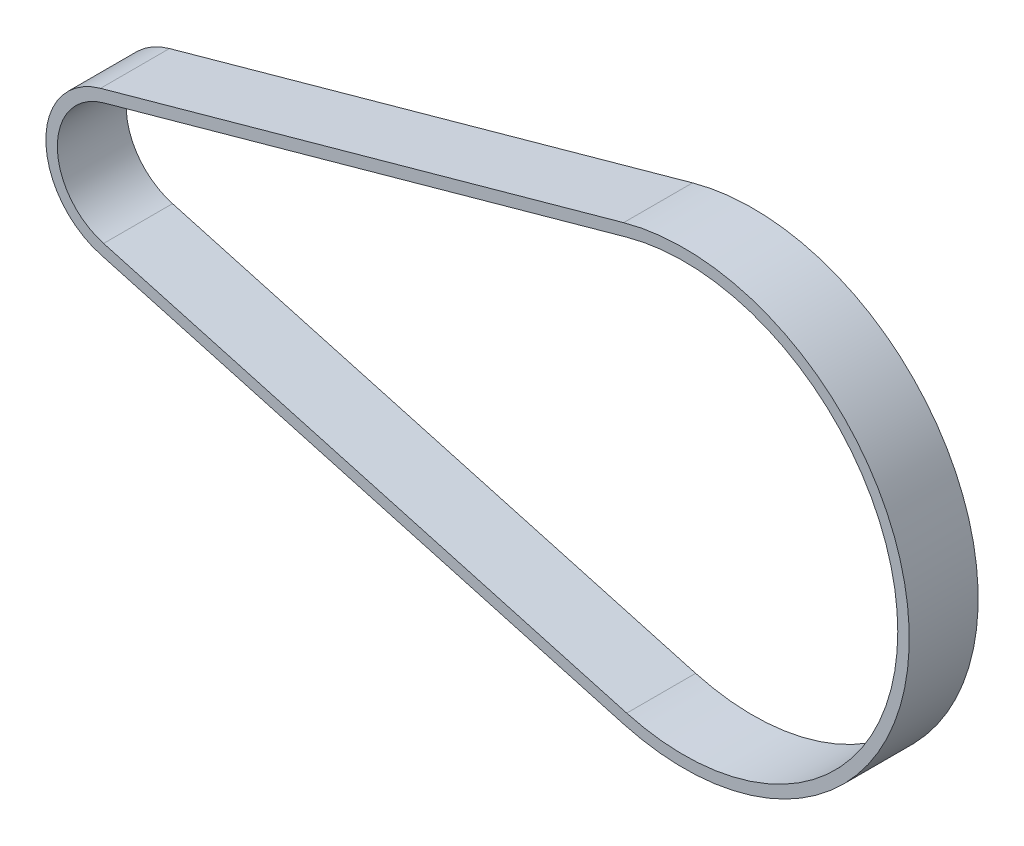
ISO-10303-21;
HEADER;
FILE_DESCRIPTION(('STEP AP214'),'2;1');
FILE_NAME('part.step','',(''),(''),'','','');
FILE_SCHEMA(('AUTOMOTIVE_DESIGN { 1 0 10303 214 1 1 1 1 }'));
ENDSEC;
DATA;
#1=APPLICATION_CONTEXT('core data for automotive mechanical design processes');
#2=APPLICATION_PROTOCOL_DEFINITION('international standard','automotive_design',2000,#1);
#3=PRODUCT_CONTEXT('',#1,'mechanical');
#4=PRODUCT('Part','Part','',(#3));
#5=PRODUCT_RELATED_PRODUCT_CATEGORY('part','',(#4));
#6=PRODUCT_DEFINITION_FORMATION('','',#4);
#7=PRODUCT_DEFINITION_CONTEXT('part definition',#1,'design');
#8=PRODUCT_DEFINITION('design','',#6,#7);
#9=PRODUCT_DEFINITION_SHAPE('','',#8);
#10=(LENGTH_UNIT() NAMED_UNIT(*) SI_UNIT(.MILLI.,.METRE.));
#11=(NAMED_UNIT(*) PLANE_ANGLE_UNIT() SI_UNIT($,.RADIAN.));
#12=(NAMED_UNIT(*) SI_UNIT($,.STERADIAN.) SOLID_ANGLE_UNIT());
#13=UNCERTAINTY_MEASURE_WITH_UNIT(LENGTH_MEASURE(1.E-05),#10,'distance_accuracy_value','');
#14=(GEOMETRIC_REPRESENTATION_CONTEXT(3) GLOBAL_UNCERTAINTY_ASSIGNED_CONTEXT((#13)) GLOBAL_UNIT_ASSIGNED_CONTEXT((#10,
#11,#12)) REPRESENTATION_CONTEXT('',''));
#15=CARTESIAN_POINT('',(0.,0.,0.));
#16=DIRECTION('',(0.,0.,1.));
#17=DIRECTION('',(1.,0.,0.));
#18=AXIS2_PLACEMENT_3D('',#15,#16,#17);
#19=CARTESIAN_POINT('',(0.,0.,6.));
#20=DIRECTION('',(0.,0.,1.));
#21=DIRECTION('',(1.,0.,0.));
#22=AXIS2_PLACEMENT_3D('',#19,#20,#21);
#23=PLANE('',#22);
#24=CARTESIAN_POINT('',(0.,0.,6.));
#25=DIRECTION('',(0.,0.,1.));
#26=DIRECTION('',(1.,0.,0.));
#27=AXIS2_PLACEMENT_3D('',#24,#25,#26);
#28=CIRCLE('',#27,6.5);
#29=CARTESIAN_POINT('',(-1.73863404689093,6.26315828085094,6.));
#30=VERTEX_POINT('',#29);
#31=CARTESIAN_POINT('',(-1.73863404689093,-6.26315828085094,6.));
#32=VERTEX_POINT('',#31);
#33=EDGE_CURVE('E135',#30,#32,#28,.T.);
#34=ORIENTED_EDGE('',*,*,#33,.T.);
#35=DIRECTION('',(0.963562812438606,-0.267482161060143,0.));
#36=VECTOR('',#35,1.);
#37=CARTESIAN_POINT('',(-1.73863404689093,-6.26315828085094,6.));
#38=LINE('',#37,#36);
#39=CARTESIAN_POINT('',(43.802,-18.9051023800454,6.));
#40=VERTEX_POINT('',#39);
#41=EDGE_CURVE('E138',#32,#40,#38,.T.);
#42=ORIENTED_EDGE('',*,*,#41,.T.);
#43=CARTESIAN_POINT('',(49.05,0.,6.));
#44=DIRECTION('',(0.,0.,1.));
#45=DIRECTION('',(1.,0.,0.));
#46=AXIS2_PLACEMENT_3D('',#43,#44,#45);
#47=CIRCLE('',#46,19.62);
#48=CARTESIAN_POINT('',(43.802,18.9051023800455,6.));
#49=VERTEX_POINT('',#48);
#50=EDGE_CURVE('E141',#40,#49,#47,.T.);
#51=ORIENTED_EDGE('',*,*,#50,.T.);
#52=DIRECTION('',(-0.963562812438606,-0.267482161060143,0.));
#53=VECTOR('',#52,1.);
#54=CARTESIAN_POINT('',(-1.73863404689093,6.26315828085094,6.));
#55=LINE('',#54,#53);
#56=EDGE_CURVE('E143',#49,#30,#55,.T.);
#57=ORIENTED_EDGE('',*,*,#56,.T.);
#58=EDGE_LOOP('',(#34,#42,#51,#57));
#59=FACE_BOUND('',#58,.T.);
#60=DIRECTION('',(0.963562812438606,-0.267482161060143,0.));
#61=VECTOR('',#60,1.);
#62=CARTESIAN_POINT('',(-1.47115188583079,-5.29959546841233,6.));
#63=LINE('',#62,#61);
#64=CARTESIAN_POINT('',(-1.47115188583079,-5.29959546841233,6.));
#65=VERTEX_POINT('',#64);
#66=CARTESIAN_POINT('',(44.0694821610601,-17.9415395676068,6.));
#67=VERTEX_POINT('',#66);
#68=EDGE_CURVE('E107',#65,#67,#63,.T.);
#69=ORIENTED_EDGE('',*,*,#68,.F.);
#70=CARTESIAN_POINT('',(0.,0.,6.));
#71=DIRECTION('',(0.,0.,1.));
#72=DIRECTION('',(1.,0.,0.));
#73=AXIS2_PLACEMENT_3D('',#70,#71,#72);
#74=CIRCLE('',#73,5.5);
#75=CARTESIAN_POINT('',(-1.47115188583079,5.29959546841233,6.));
#76=VERTEX_POINT('',#75);
#77=EDGE_CURVE('E99',#76,#65,#74,.T.);
#78=ORIENTED_EDGE('',*,*,#77,.F.);
#79=DIRECTION('',(-0.963562812438606,-0.267482161060143,0.));
#80=VECTOR('',#79,1.);
#81=CARTESIAN_POINT('',(-1.47115188583079,5.29959546841233,6.));
#82=LINE('',#81,#80);
#83=CARTESIAN_POINT('',(44.0694821610601,17.9415395676068,6.));
#84=VERTEX_POINT('',#83);
#85=EDGE_CURVE('E121',#84,#76,#82,.T.);
#86=ORIENTED_EDGE('',*,*,#85,.F.);
#87=CARTESIAN_POINT('',(49.05,0.,6.));
#88=DIRECTION('',(0.,0.,1.));
#89=DIRECTION('',(1.,0.,0.));
#90=AXIS2_PLACEMENT_3D('',#87,#88,#89);
#91=CIRCLE('',#90,18.62);
#92=EDGE_CURVE('E119',#67,#84,#91,.T.);
#93=ORIENTED_EDGE('',*,*,#92,.F.);
#94=EDGE_LOOP('',(#69,#78,#86,#93));
#95=FACE_BOUND('',#94,.T.);
#96=ADVANCED_FACE('F34',(#59,#95),#23,.T.);
#97=CARTESIAN_POINT('',(0.,0.,0.));
#98=DIRECTION('',(0.,0.,1.));
#99=DIRECTION('',(1.,0.,0.));
#100=AXIS2_PLACEMENT_3D('',#97,#98,#99);
#101=PLANE('',#100);
#102=CARTESIAN_POINT('',(0.,0.,0.));
#103=DIRECTION('',(0.,0.,1.));
#104=DIRECTION('',(1.,0.,0.));
#105=AXIS2_PLACEMENT_3D('',#102,#103,#104);
#106=CIRCLE('',#105,6.5);
#107=CARTESIAN_POINT('',(-1.73863404689093,6.26315828085094,0.));
#108=VERTEX_POINT('',#107);
#109=CARTESIAN_POINT('',(-1.73863404689093,-6.26315828085094,0.));
#110=VERTEX_POINT('',#109);
#111=EDGE_CURVE('E115',#108,#110,#106,.T.);
#112=ORIENTED_EDGE('',*,*,#111,.F.);
#113=DIRECTION('',(-0.963562812438606,-0.267482161060143,0.));
#114=VECTOR('',#113,1.);
#115=CARTESIAN_POINT('',(-1.73863404689093,6.26315828085094,0.));
#116=LINE('',#115,#114);
#117=CARTESIAN_POINT('',(43.802,18.9051023800455,0.));
#118=VERTEX_POINT('',#117);
#119=EDGE_CURVE('E139',#118,#108,#116,.T.);
#120=ORIENTED_EDGE('',*,*,#119,.F.);
#121=CARTESIAN_POINT('',(49.05,0.,0.));
#122=DIRECTION('',(0.,0.,1.));
#123=DIRECTION('',(1.,0.,0.));
#124=AXIS2_PLACEMENT_3D('',#121,#122,#123);
#125=CIRCLE('',#124,19.62);
#126=CARTESIAN_POINT('',(43.802,-18.9051023800454,0.));
#127=VERTEX_POINT('',#126);
#128=EDGE_CURVE('E150',#127,#118,#125,.T.);
#129=ORIENTED_EDGE('',*,*,#128,.F.);
#130=DIRECTION('',(0.963562812438606,-0.267482161060143,0.));
#131=VECTOR('',#130,1.);
#132=CARTESIAN_POINT('',(-1.73863404689093,-6.26315828085094,0.));
#133=LINE('',#132,#131);
#134=EDGE_CURVE('E148',#110,#127,#133,.T.);
#135=ORIENTED_EDGE('',*,*,#134,.F.);
#136=EDGE_LOOP('',(#112,#120,#129,#135));
#137=FACE_BOUND('',#136,.T.);
#138=CARTESIAN_POINT('',(0.,0.,0.));
#139=DIRECTION('',(0.,0.,1.));
#140=DIRECTION('',(1.,0.,0.));
#141=AXIS2_PLACEMENT_3D('',#138,#139,#140);
#142=CIRCLE('',#141,5.5);
#143=CARTESIAN_POINT('',(-1.47115188583079,5.29959546841233,0.));
#144=VERTEX_POINT('',#143);
#145=CARTESIAN_POINT('',(-1.47115188583079,-5.29959546841233,0.));
#146=VERTEX_POINT('',#145);
#147=EDGE_CURVE('E57',#144,#146,#142,.T.);
#148=ORIENTED_EDGE('',*,*,#147,.T.);
#149=DIRECTION('',(0.963562812438606,-0.267482161060143,0.));
#150=VECTOR('',#149,1.);
#151=CARTESIAN_POINT('',(-1.47115188583079,-5.29959546841233,0.));
#152=LINE('',#151,#150);
#153=CARTESIAN_POINT('',(44.0694821610601,-17.9415395676068,0.));
#154=VERTEX_POINT('',#153);
#155=EDGE_CURVE('E114',#146,#154,#152,.T.);
#156=ORIENTED_EDGE('',*,*,#155,.T.);
#157=CARTESIAN_POINT('',(49.05,0.,0.));
#158=DIRECTION('',(0.,0.,1.));
#159=DIRECTION('',(1.,0.,0.));
#160=AXIS2_PLACEMENT_3D('',#157,#158,#159);
#161=CIRCLE('',#160,18.62);
#162=CARTESIAN_POINT('',(44.0694821610601,17.9415395676068,0.));
#163=VERTEX_POINT('',#162);
#164=EDGE_CURVE('E127',#154,#163,#161,.T.);
#165=ORIENTED_EDGE('',*,*,#164,.T.);
#166=DIRECTION('',(-0.963562812438606,-0.267482161060143,0.));
#167=VECTOR('',#166,1.);
#168=CARTESIAN_POINT('',(-1.47115188583079,5.29959546841233,0.));
#169=LINE('',#168,#167);
#170=EDGE_CURVE('E108',#163,#144,#169,.T.);
#171=ORIENTED_EDGE('',*,*,#170,.T.);
#172=EDGE_LOOP('',(#148,#156,#165,#171));
#173=FACE_BOUND('',#172,.T.);
#174=ADVANCED_FACE('F168',(#137,#173),#101,.F.);
#175=CARTESIAN_POINT('',(0.,0.,6.));
#176=DIRECTION('',(0.,0.,-1.));
#177=DIRECTION('',(-1.,0.,0.));
#178=AXIS2_PLACEMENT_3D('',#175,#176,#177);
#179=CYLINDRICAL_SURFACE('',#178,6.5);
#180=ORIENTED_EDGE('',*,*,#111,.T.);
#181=DIRECTION('',(0.,0.,-1.));
#182=VECTOR('',#181,1.);
#183=CARTESIAN_POINT('',(-1.73863404689093,-6.26315828085094,6.));
#184=LINE('',#183,#182);
#185=EDGE_CURVE('E11',#32,#110,#184,.T.);
#186=ORIENTED_EDGE('',*,*,#185,.F.);
#187=ORIENTED_EDGE('',*,*,#33,.F.);
#188=DIRECTION('',(0.,0.,-1.));
#189=VECTOR('',#188,1.);
#190=CARTESIAN_POINT('',(-1.73863404689093,6.26315828085094,6.));
#191=LINE('',#190,#189);
#192=EDGE_CURVE('E145',#30,#108,#191,.T.);
#193=ORIENTED_EDGE('',*,*,#192,.T.);
#194=EDGE_LOOP('',(#180,#186,#187,#193));
#195=FACE_BOUND('',#194,.T.);
#196=ADVANCED_FACE('F36',(#195),#179,.T.);
#197=CARTESIAN_POINT('',(-1.73863404689093,-6.26315828085094,6.));
#198=DIRECTION('',(0.267482161060143,0.963562812438606,0.));
#199=DIRECTION('',(-0.963562812438606,0.267482161060143,0.));
#200=AXIS2_PLACEMENT_3D('',#197,#198,#199);
#201=PLANE('',#200);
#202=ORIENTED_EDGE('',*,*,#134,.T.);
#203=DIRECTION('',(0.,0.,-1.));
#204=VECTOR('',#203,1.);
#205=CARTESIAN_POINT('',(43.802,-18.9051023800454,6.));
#206=LINE('',#205,#204);
#207=EDGE_CURVE('E42',#40,#127,#206,.T.);
#208=ORIENTED_EDGE('',*,*,#207,.F.);
#209=ORIENTED_EDGE('',*,*,#41,.F.);
#210=ORIENTED_EDGE('',*,*,#185,.T.);
#211=EDGE_LOOP('',(#202,#208,#209,#210));
#212=FACE_BOUND('',#211,.T.);
#213=ADVANCED_FACE('F178',(#212),#201,.F.);
#214=CARTESIAN_POINT('',(49.05,0.,6.));
#215=DIRECTION('',(0.,0.,-1.));
#216=DIRECTION('',(-1.,0.,0.));
#217=AXIS2_PLACEMENT_3D('',#214,#215,#216);
#218=CYLINDRICAL_SURFACE('',#217,19.62);
#219=ORIENTED_EDGE('',*,*,#128,.T.);
#220=DIRECTION('',(0.,0.,-1.));
#221=VECTOR('',#220,1.);
#222=CARTESIAN_POINT('',(43.802,18.9051023800455,6.));
#223=LINE('',#222,#221);
#224=EDGE_CURVE('E155',#49,#118,#223,.T.);
#225=ORIENTED_EDGE('',*,*,#224,.F.);
#226=ORIENTED_EDGE('',*,*,#50,.F.);
#227=ORIENTED_EDGE('',*,*,#207,.T.);
#228=EDGE_LOOP('',(#219,#225,#226,#227));
#229=FACE_BOUND('',#228,.T.);
#230=ADVANCED_FACE('F162',(#229),#218,.T.);
#231=CARTESIAN_POINT('',(-1.73863404689093,6.26315828085094,6.));
#232=DIRECTION('',(0.267482161060143,-0.963562812438606,0.));
#233=DIRECTION('',(0.963562812438606,0.267482161060143,0.));
#234=AXIS2_PLACEMENT_3D('',#231,#232,#233);
#235=PLANE('',#234);
#236=ORIENTED_EDGE('',*,*,#119,.T.);
#237=ORIENTED_EDGE('',*,*,#192,.F.);
#238=ORIENTED_EDGE('',*,*,#56,.F.);
#239=ORIENTED_EDGE('',*,*,#224,.T.);
#240=EDGE_LOOP('',(#236,#237,#238,#239));
#241=FACE_BOUND('',#240,.T.);
#242=ADVANCED_FACE('F172',(#241),#235,.F.);
#243=CARTESIAN_POINT('',(0.,0.,6.));
#244=DIRECTION('',(0.,0.,-1.));
#245=DIRECTION('',(-1.,0.,0.));
#246=AXIS2_PLACEMENT_3D('',#243,#244,#245);
#247=CYLINDRICAL_SURFACE('',#246,5.5);
#248=ORIENTED_EDGE('',*,*,#147,.F.);
#249=DIRECTION('',(0.,0.,-1.));
#250=VECTOR('',#249,1.);
#251=CARTESIAN_POINT('',(-1.47115188583079,5.29959546841233,6.));
#252=LINE('',#251,#250);
#253=EDGE_CURVE('E103',#76,#144,#252,.T.);
#254=ORIENTED_EDGE('',*,*,#253,.F.);
#255=ORIENTED_EDGE('',*,*,#77,.T.);
#256=DIRECTION('',(0.,0.,-1.));
#257=VECTOR('',#256,1.);
#258=CARTESIAN_POINT('',(-1.47115188583079,-5.29959546841233,6.));
#259=LINE('',#258,#257);
#260=EDGE_CURVE('E102',#65,#146,#259,.T.);
#261=ORIENTED_EDGE('',*,*,#260,.T.);
#262=EDGE_LOOP('',(#248,#254,#255,#261));
#263=FACE_BOUND('',#262,.T.);
#264=ADVANCED_FACE('F101',(#263),#247,.F.);
#265=CARTESIAN_POINT('',(-1.47115188583079,-5.29959546841233,6.));
#266=DIRECTION('',(0.267482161060143,0.963562812438606,0.));
#267=DIRECTION('',(-0.963562812438606,0.267482161060143,0.));
#268=AXIS2_PLACEMENT_3D('',#265,#266,#267);
#269=PLANE('',#268);
#270=ORIENTED_EDGE('',*,*,#155,.F.);
#271=ORIENTED_EDGE('',*,*,#260,.F.);
#272=ORIENTED_EDGE('',*,*,#68,.T.);
#273=DIRECTION('',(0.,0.,-1.));
#274=VECTOR('',#273,1.);
#275=CARTESIAN_POINT('',(44.0694821610601,-17.9415395676068,6.));
#276=LINE('',#275,#274);
#277=EDGE_CURVE('E116',#67,#154,#276,.T.);
#278=ORIENTED_EDGE('',*,*,#277,.T.);
#279=EDGE_LOOP('',(#270,#271,#272,#278));
#280=FACE_BOUND('',#279,.T.);
#281=ADVANCED_FACE('F111',(#280),#269,.T.);
#282=CARTESIAN_POINT('',(49.05,0.,6.));
#283=DIRECTION('',(0.,0.,-1.));
#284=DIRECTION('',(-1.,0.,0.));
#285=AXIS2_PLACEMENT_3D('',#282,#283,#284);
#286=CYLINDRICAL_SURFACE('',#285,18.62);
#287=ORIENTED_EDGE('',*,*,#164,.F.);
#288=ORIENTED_EDGE('',*,*,#277,.F.);
#289=ORIENTED_EDGE('',*,*,#92,.T.);
#290=DIRECTION('',(0.,0.,-1.));
#291=VECTOR('',#290,1.);
#292=CARTESIAN_POINT('',(44.0694821610601,17.9415395676068,6.));
#293=LINE('',#292,#291);
#294=EDGE_CURVE('E49',#84,#163,#293,.T.);
#295=ORIENTED_EDGE('',*,*,#294,.T.);
#296=EDGE_LOOP('',(#287,#288,#289,#295));
#297=FACE_BOUND('',#296,.T.);
#298=ADVANCED_FACE('F201',(#297),#286,.F.);
#299=CARTESIAN_POINT('',(-1.47115188583079,5.29959546841233,6.));
#300=DIRECTION('',(0.267482161060143,-0.963562812438606,0.));
#301=DIRECTION('',(0.963562812438606,0.267482161060143,0.));
#302=AXIS2_PLACEMENT_3D('',#299,#300,#301);
#303=PLANE('',#302);
#304=ORIENTED_EDGE('',*,*,#170,.F.);
#305=ORIENTED_EDGE('',*,*,#294,.F.);
#306=ORIENTED_EDGE('',*,*,#85,.T.);
#307=ORIENTED_EDGE('',*,*,#253,.T.);
#308=EDGE_LOOP('',(#304,#305,#306,#307));
#309=FACE_BOUND('',#308,.T.);
#310=ADVANCED_FACE('F205',(#309),#303,.T.);
#311=CLOSED_SHELL('',(#96,#174,#196,#213,#230,#242,#264,#281,#298,#310));
#312=MANIFOLD_SOLID_BREP('B2',#311);
#313=ADVANCED_BREP_SHAPE_REPRESENTATION('',(#18,#312),#14);
#314=SHAPE_DEFINITION_REPRESENTATION(#9,#313);
ENDSEC;
END-ISO-10303-21;
